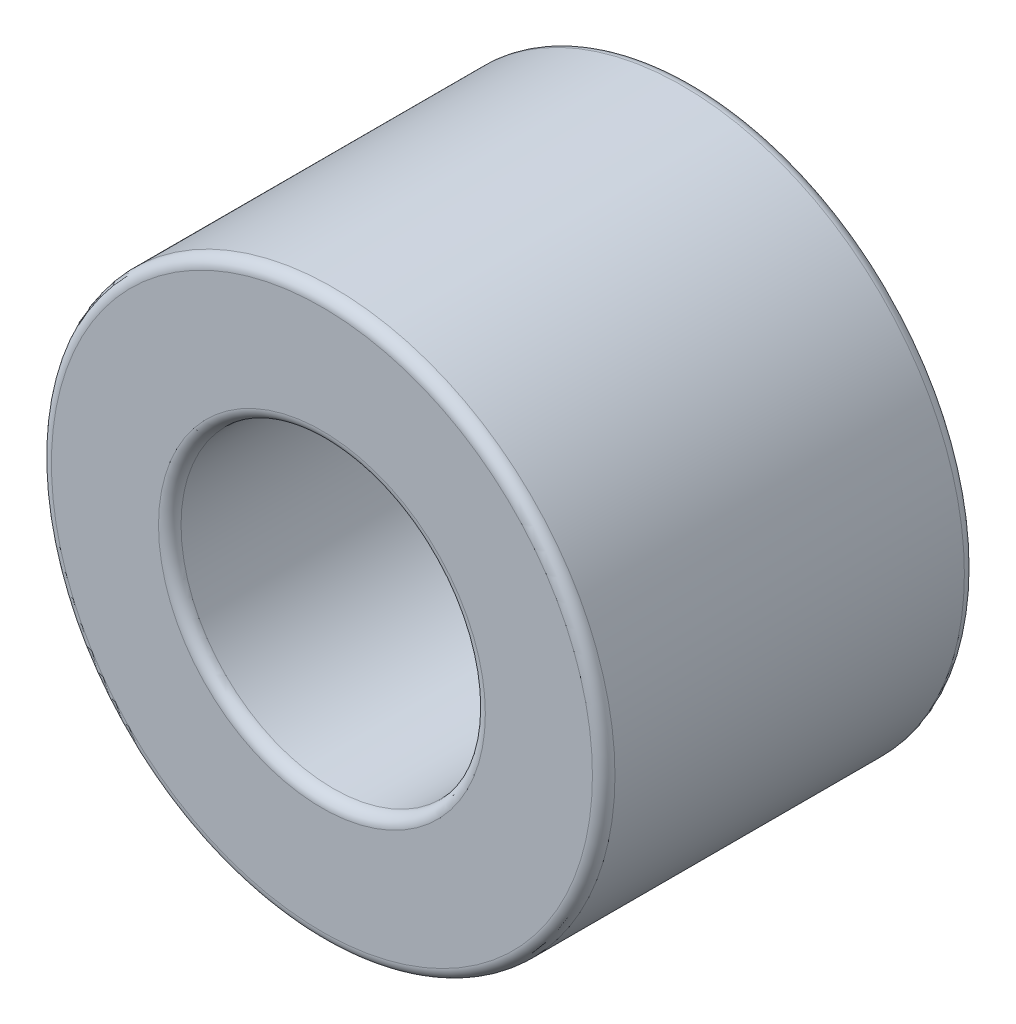
ISO-10303-21;
HEADER;
FILE_DESCRIPTION(('STEP AP214'),'2;1');
FILE_NAME('part.step','',(''),(''),'','','');
FILE_SCHEMA(('AUTOMOTIVE_DESIGN { 1 0 10303 214 1 1 1 1 }'));
ENDSEC;
DATA;
#1=APPLICATION_CONTEXT('core data for automotive mechanical design processes');
#2=APPLICATION_PROTOCOL_DEFINITION('international standard','automotive_design',2000,#1);
#3=PRODUCT_CONTEXT('',#1,'mechanical');
#4=PRODUCT('Part','Part','',(#3));
#5=PRODUCT_RELATED_PRODUCT_CATEGORY('part','',(#4));
#6=PRODUCT_DEFINITION_FORMATION('','',#4);
#7=PRODUCT_DEFINITION_CONTEXT('part definition',#1,'design');
#8=PRODUCT_DEFINITION('design','',#6,#7);
#9=PRODUCT_DEFINITION_SHAPE('','',#8);
#10=(LENGTH_UNIT() NAMED_UNIT(*) SI_UNIT(.MILLI.,.METRE.));
#11=(NAMED_UNIT(*) PLANE_ANGLE_UNIT() SI_UNIT($,.RADIAN.));
#12=(NAMED_UNIT(*) SI_UNIT($,.STERADIAN.) SOLID_ANGLE_UNIT());
#13=UNCERTAINTY_MEASURE_WITH_UNIT(LENGTH_MEASURE(1.E-05),#10,'distance_accuracy_value','');
#14=(GEOMETRIC_REPRESENTATION_CONTEXT(3) GLOBAL_UNCERTAINTY_ASSIGNED_CONTEXT((#13)) GLOBAL_UNIT_ASSIGNED_CONTEXT((#10,
#11,#12)) REPRESENTATION_CONTEXT('',''));
#15=CARTESIAN_POINT('',(0.,0.,0.));
#16=DIRECTION('',(0.,0.,1.));
#17=DIRECTION('',(1.,0.,0.));
#18=AXIS2_PLACEMENT_3D('',#15,#16,#17);
#19=CARTESIAN_POINT('',(0.,0.,4.191));
#20=DIRECTION('',(0.,0.,1.));
#21=DIRECTION('',(1.,0.,0.));
#22=AXIS2_PLACEMENT_3D('',#19,#20,#21);
#23=PLANE('',#22);
#24=CARTESIAN_POINT('',(0.,0.,4.191));
#25=DIRECTION('',(0.,0.,1.));
#26=DIRECTION('',(1.,0.,0.));
#27=AXIS2_PLACEMENT_3D('',#24,#25,#26);
#28=CIRCLE('',#27,1.8415);
#29=CARTESIAN_POINT('',(1.8415,0.,4.191));
#30=VERTEX_POINT('',#29);
#31=EDGE_CURVE('E10',#30,#30,#28,.F.);
#32=ORIENTED_EDGE('',*,*,#31,.T.);
#33=EDGE_LOOP('',(#32));
#34=FACE_BOUND('',#33,.T.);
#35=CARTESIAN_POINT('',(0.,0.,4.191));
#36=DIRECTION('',(0.,0.,1.));
#37=DIRECTION('',(1.,0.,0.));
#38=AXIS2_PLACEMENT_3D('',#35,#36,#37);
#39=CIRCLE('',#38,3.048);
#40=CARTESIAN_POINT('',(3.048,0.,4.191));
#41=VERTEX_POINT('',#40);
#42=EDGE_CURVE('E48',#41,#41,#39,.T.);
#43=ORIENTED_EDGE('',*,*,#42,.T.);
#44=EDGE_LOOP('',(#43));
#45=FACE_BOUND('',#44,.T.);
#46=ADVANCED_FACE('F41',(#34,#45),#23,.T.);
#47=CARTESIAN_POINT('',(0.,0.,0.));
#48=DIRECTION('',(0.,0.,1.));
#49=DIRECTION('',(1.,0.,0.));
#50=AXIS2_PLACEMENT_3D('',#47,#48,#49);
#51=PLANE('',#50);
#52=CARTESIAN_POINT('',(0.,0.,0.));
#53=DIRECTION('',(0.,0.,1.));
#54=DIRECTION('',(1.,0.,0.));
#55=AXIS2_PLACEMENT_3D('',#52,#53,#54);
#56=CIRCLE('',#55,1.8415);
#57=CARTESIAN_POINT('',(1.8415,0.,0.));
#58=VERTEX_POINT('',#57);
#59=EDGE_CURVE('E67',#58,#58,#56,.T.);
#60=ORIENTED_EDGE('',*,*,#59,.T.);
#61=EDGE_LOOP('',(#60));
#62=FACE_BOUND('',#61,.T.);
#63=CARTESIAN_POINT('',(0.,0.,0.));
#64=DIRECTION('',(0.,0.,1.));
#65=DIRECTION('',(1.,0.,0.));
#66=AXIS2_PLACEMENT_3D('',#63,#64,#65);
#67=CIRCLE('',#66,3.048);
#68=CARTESIAN_POINT('',(3.048,0.,0.));
#69=VERTEX_POINT('',#68);
#70=EDGE_CURVE('E70',#69,#69,#67,.F.);
#71=ORIENTED_EDGE('',*,*,#70,.T.);
#72=EDGE_LOOP('',(#71));
#73=FACE_BOUND('',#72,.T.);
#74=ADVANCED_FACE('F74',(#62,#73),#51,.F.);
#75=CARTESIAN_POINT('',(0.,0.,4.191));
#76=DIRECTION('',(0.,0.,-1.));
#77=DIRECTION('',(-1.,0.,0.));
#78=AXIS2_PLACEMENT_3D('',#75,#76,#77);
#79=CYLINDRICAL_SURFACE('',#78,3.175);
#80=CARTESIAN_POINT('',(0.,0.,0.127));
#81=DIRECTION('',(0.,0.,1.));
#82=DIRECTION('',(1.,0.,0.));
#83=AXIS2_PLACEMENT_3D('',#80,#81,#82);
#84=CIRCLE('',#83,3.175);
#85=CARTESIAN_POINT('',(3.175,0.,0.127));
#86=VERTEX_POINT('',#85);
#87=EDGE_CURVE('E52',#86,#86,#84,.T.);
#88=ORIENTED_EDGE('',*,*,#87,.T.);
#89=EDGE_LOOP('',(#88));
#90=FACE_BOUND('',#89,.T.);
#91=CARTESIAN_POINT('',(0.,0.,4.064));
#92=DIRECTION('',(0.,0.,1.));
#93=DIRECTION('',(1.,0.,0.));
#94=AXIS2_PLACEMENT_3D('',#91,#92,#93);
#95=CIRCLE('',#94,3.175);
#96=CARTESIAN_POINT('',(3.175,0.,4.064));
#97=VERTEX_POINT('',#96);
#98=EDGE_CURVE('E56',#97,#97,#95,.F.);
#99=ORIENTED_EDGE('',*,*,#98,.T.);
#100=EDGE_LOOP('',(#99));
#101=FACE_BOUND('',#100,.T.);
#102=ADVANCED_FACE('F84',(#90,#101),#79,.T.);
#103=CARTESIAN_POINT('',(0.,0.,4.191));
#104=DIRECTION('',(0.,0.,-1.));
#105=DIRECTION('',(-1.,0.,0.));
#106=AXIS2_PLACEMENT_3D('',#103,#104,#105);
#107=CYLINDRICAL_SURFACE('',#106,1.7145);
#108=CARTESIAN_POINT('',(0.,0.,0.127));
#109=DIRECTION('',(0.,0.,1.));
#110=DIRECTION('',(1.,0.,0.));
#111=AXIS2_PLACEMENT_3D('',#108,#109,#110);
#112=CIRCLE('',#111,1.7145);
#113=CARTESIAN_POINT('',(1.7145,0.,0.127));
#114=VERTEX_POINT('',#113);
#115=EDGE_CURVE('E61',#114,#114,#112,.F.);
#116=ORIENTED_EDGE('',*,*,#115,.T.);
#117=EDGE_LOOP('',(#116));
#118=FACE_BOUND('',#117,.T.);
#119=CARTESIAN_POINT('',(0.,0.,4.064));
#120=DIRECTION('',(0.,0.,1.));
#121=DIRECTION('',(1.,0.,0.));
#122=AXIS2_PLACEMENT_3D('',#119,#120,#121);
#123=CIRCLE('',#122,1.7145);
#124=CARTESIAN_POINT('',(1.7145,0.,4.064));
#125=VERTEX_POINT('',#124);
#126=EDGE_CURVE('E64',#125,#125,#123,.T.);
#127=ORIENTED_EDGE('',*,*,#126,.T.);
#128=EDGE_LOOP('',(#127));
#129=FACE_BOUND('',#128,.T.);
#130=ADVANCED_FACE('F87',(#118,#129),#107,.F.);
#131=CARTESIAN_POINT('',(0.,0.,0.127));
#132=DIRECTION('',(0.,0.,1.));
#133=DIRECTION('',(1.,0.,0.));
#134=AXIS2_PLACEMENT_3D('',#131,#132,#133);
#135=TOROIDAL_SURFACE('',#134,1.8415,0.127);
#136=ORIENTED_EDGE('',*,*,#115,.F.);
#137=EDGE_LOOP('',(#136));
#138=FACE_BOUND('',#137,.T.);
#139=ORIENTED_EDGE('',*,*,#59,.F.);
#140=EDGE_LOOP('',(#139));
#141=FACE_BOUND('',#140,.T.);
#142=ADVANCED_FACE('F80',(#138,#141),#135,.T.);
#143=CARTESIAN_POINT('',(0.,0.,0.127));
#144=DIRECTION('',(0.,0.,1.));
#145=DIRECTION('',(1.,0.,0.));
#146=AXIS2_PLACEMENT_3D('',#143,#144,#145);
#147=TOROIDAL_SURFACE('',#146,3.048,0.127);
#148=ORIENTED_EDGE('',*,*,#70,.F.);
#149=EDGE_LOOP('',(#148));
#150=FACE_BOUND('',#149,.T.);
#151=ORIENTED_EDGE('',*,*,#87,.F.);
#152=EDGE_LOOP('',(#151));
#153=FACE_BOUND('',#152,.T.);
#154=ADVANCED_FACE('F76',(#150,#153),#147,.T.);
#155=CARTESIAN_POINT('',(0.,0.,4.064));
#156=DIRECTION('',(0.,0.,1.));
#157=DIRECTION('',(1.,0.,0.));
#158=AXIS2_PLACEMENT_3D('',#155,#156,#157);
#159=TOROIDAL_SURFACE('',#158,1.8415,0.127);
#160=ORIENTED_EDGE('',*,*,#31,.F.);
#161=EDGE_LOOP('',(#160));
#162=FACE_BOUND('',#161,.T.);
#163=ORIENTED_EDGE('',*,*,#126,.F.);
#164=EDGE_LOOP('',(#163));
#165=FACE_BOUND('',#164,.T.);
#166=ADVANCED_FACE('F79',(#162,#165),#159,.T.);
#167=CARTESIAN_POINT('',(0.,0.,4.064));
#168=DIRECTION('',(0.,0.,1.));
#169=DIRECTION('',(1.,0.,0.));
#170=AXIS2_PLACEMENT_3D('',#167,#168,#169);
#171=TOROIDAL_SURFACE('',#170,3.048,0.127);
#172=ORIENTED_EDGE('',*,*,#98,.F.);
#173=EDGE_LOOP('',(#172));
#174=FACE_BOUND('',#173,.T.);
#175=ORIENTED_EDGE('',*,*,#42,.F.);
#176=EDGE_LOOP('',(#175));
#177=FACE_BOUND('',#176,.T.);
#178=ADVANCED_FACE('F43',(#174,#177),#171,.T.);
#179=CLOSED_SHELL('',(#46,#74,#102,#130,#142,#154,#166,#178));
#180=MANIFOLD_SOLID_BREP('B2',#179);
#181=ADVANCED_BREP_SHAPE_REPRESENTATION('',(#18,#180),#14);
#182=SHAPE_DEFINITION_REPRESENTATION(#9,#181);
ENDSEC;
END-ISO-10303-21;
